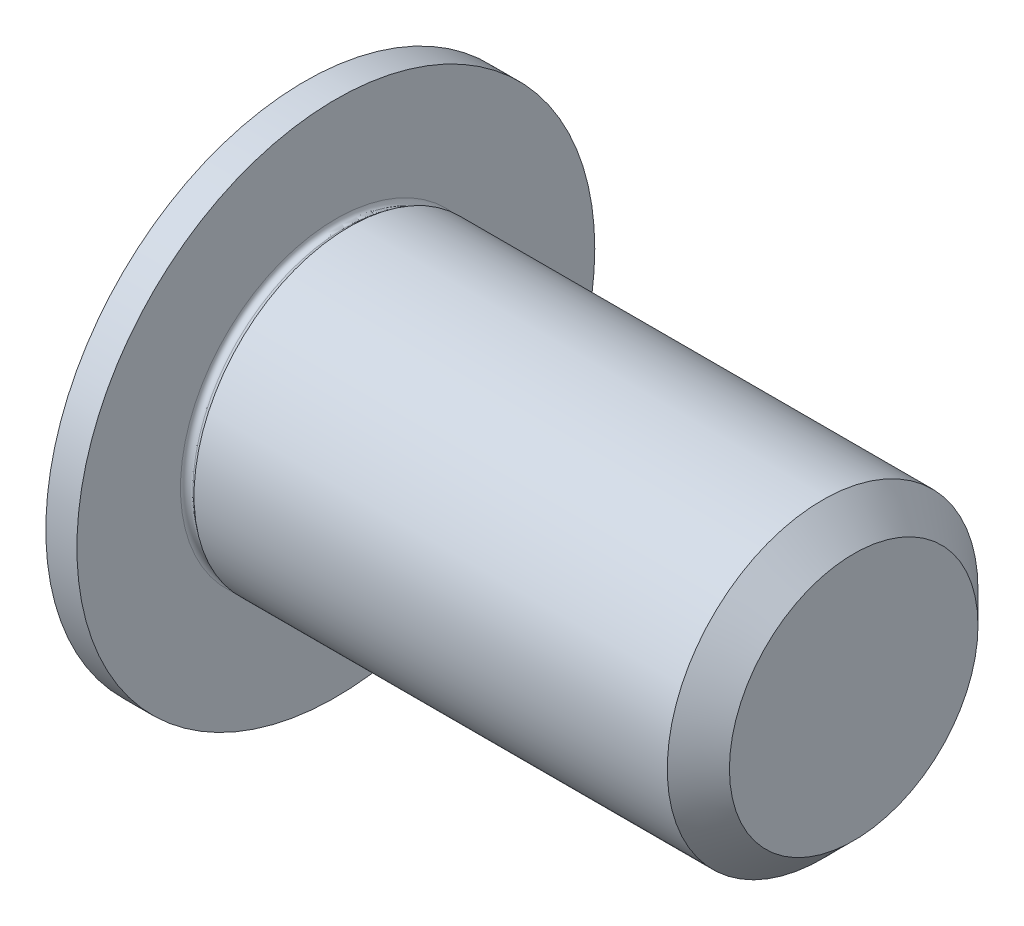
ISO-10303-21;
HEADER;
FILE_DESCRIPTION(('STEP AP214'),'2;1');
FILE_NAME('part.step','',(''),(''),'','','');
FILE_SCHEMA(('AUTOMOTIVE_DESIGN { 1 0 10303 214 1 1 1 1 }'));
ENDSEC;
DATA;
#1=APPLICATION_CONTEXT('core data for automotive mechanical design processes');
#2=APPLICATION_PROTOCOL_DEFINITION('international standard','automotive_design',2000,#1);
#3=PRODUCT_CONTEXT('',#1,'mechanical');
#4=PRODUCT('Part','Part','',(#3));
#5=PRODUCT_RELATED_PRODUCT_CATEGORY('part','',(#4));
#6=PRODUCT_DEFINITION_FORMATION('','',#4);
#7=PRODUCT_DEFINITION_CONTEXT('part definition',#1,'design');
#8=PRODUCT_DEFINITION('design','',#6,#7);
#9=PRODUCT_DEFINITION_SHAPE('','',#8);
#10=(LENGTH_UNIT() NAMED_UNIT(*) SI_UNIT(.MILLI.,.METRE.));
#11=(NAMED_UNIT(*) PLANE_ANGLE_UNIT() SI_UNIT($,.RADIAN.));
#12=(NAMED_UNIT(*) SI_UNIT($,.STERADIAN.) SOLID_ANGLE_UNIT());
#13=UNCERTAINTY_MEASURE_WITH_UNIT(LENGTH_MEASURE(1.E-05),#10,'distance_accuracy_value','');
#14=(GEOMETRIC_REPRESENTATION_CONTEXT(3) GLOBAL_UNCERTAINTY_ASSIGNED_CONTEXT((#13)) GLOBAL_UNIT_ASSIGNED_CONTEXT((#10,
#11,#12)) REPRESENTATION_CONTEXT('',''));
#15=CARTESIAN_POINT('',(0.,0.,0.));
#16=DIRECTION('',(0.,0.,1.));
#17=DIRECTION('',(1.,0.,0.));
#18=AXIS2_PLACEMENT_3D('',#15,#16,#17);
#19=CARTESIAN_POINT('',(0.,0.,0.));
#20=DIRECTION('',(0.999999999999998,0.,0.));
#21=DIRECTION('',(0.,0.,-1.00000000000002));
#22=AXIS2_PLACEMENT_3D('',#19,#20,#21);
#23=PLANE('',#22);
#24=CARTESIAN_POINT('',(0.,0.,0.));
#25=DIRECTION('',(0.999999999999998,0.,0.));
#26=DIRECTION('',(0.,0.,-1.00000000000002));
#27=AXIS2_PLACEMENT_3D('',#24,#25,#26);
#28=CIRCLE('',#27,2.4);
#29=CARTESIAN_POINT('',(0.,0.,-2.40000000000004));
#30=VERTEX_POINT('',#29);
#31=EDGE_CURVE('E64',#30,#30,#28,.T.);
#32=ORIENTED_EDGE('',*,*,#31,.T.);
#33=EDGE_LOOP('',(#32));
#34=FACE_BOUND('',#33,.T.);
#35=ADVANCED_FACE('F53',(#34),#23,.T.);
#36=CARTESIAN_POINT('',(0.,0.,0.));
#37=DIRECTION('',(0.999999999999998,0.,0.));
#38=DIRECTION('',(0.,0.,-1.00000000000002));
#39=AXIS2_PLACEMENT_3D('',#36,#37,#38);
#40=CYLINDRICAL_SURFACE('',#39,3.);
#41=CARTESIAN_POINT('',(-0.600000000000156,0.,-2.22044604925031E-13));
#42=DIRECTION('',(0.999999999999998,0.,0.));
#43=DIRECTION('',(0.,0.,-1.00000000000002));
#44=AXIS2_PLACEMENT_3D('',#41,#42,#43);
#45=CIRCLE('',#44,3.);
#46=CARTESIAN_POINT('',(-0.600000000000156,0.,-3.00000000000005));
#47=VERTEX_POINT('',#46);
#48=EDGE_CURVE('E12',#47,#47,#45,.F.);
#49=CARTESIAN_POINT('',(-9.73819660112496,0.,1.77635683940025E-12));
#50=DIRECTION('',(0.999999999999998,0.,0.));
#51=DIRECTION('',(0.,0.,-1.00000000000002));
#52=AXIS2_PLACEMENT_3D('',#49,#50,#51);
#53=CIRCLE('',#52,3.);
#54=CARTESIAN_POINT('',(-9.73819660112496,0.,-3.00000000000005));
#55=VERTEX_POINT('',#54);
#56=EDGE_CURVE('E188',#55,#55,#53,.T.);
#57=CARTESIAN_POINT('',(-0.600000000000156,0.,-3.00000000000005));
#58=CARTESIAN_POINT('',(-0.695189547928539,0.,-3.00000000000005));
#59=CARTESIAN_POINT('',(-0.790379095856923,0.,-3.00000000000005));
#60=CARTESIAN_POINT('',(-0.980758191713689,0.,-3.00000000000005));
#61=CARTESIAN_POINT('',(-1.07594773964207,0.,-3.00000000000005));
#62=CARTESIAN_POINT('',(-1.26632683549884,0.,-3.00000000000005));
#63=CARTESIAN_POINT('',(-1.36151638342722,0.,-3.00000000000005));
#64=CARTESIAN_POINT('',(-1.55189547928399,0.,-3.00000000000005));
#65=CARTESIAN_POINT('',(-1.64708502721237,0.,-3.00000000000005));
#66=CARTESIAN_POINT('',(-1.83746412306914,0.,-3.00000000000005));
#67=CARTESIAN_POINT('',(-1.93265367099752,0.,-3.00000000000005));
#68=CARTESIAN_POINT('',(-2.12303276685429,0.,-3.00000000000005));
#69=CARTESIAN_POINT('',(-2.21822231478267,0.,-3.00000000000005));
#70=CARTESIAN_POINT('',(-2.40860141063944,0.,-3.00000000000005));
#71=CARTESIAN_POINT('',(-2.50379095856782,0.,-3.00000000000005));
#72=CARTESIAN_POINT('',(-2.69417005442459,0.,-3.00000000000005));
#73=CARTESIAN_POINT('',(-2.78935960235297,0.,-3.00000000000005));
#74=CARTESIAN_POINT('',(-2.97973869820974,0.,-3.00000000000005));
#75=CARTESIAN_POINT('',(-3.07492824613812,0.,-3.00000000000005));
#76=CARTESIAN_POINT('',(-3.26530734199489,0.,-3.00000000000005));
#77=CARTESIAN_POINT('',(-3.36049688992327,0.,-3.00000000000005));
#78=CARTESIAN_POINT('',(-3.55087598578004,0.,-3.00000000000005));
#79=CARTESIAN_POINT('',(-3.64606553370842,0.,-3.00000000000005));
#80=CARTESIAN_POINT('',(-3.83644462956519,0.,-3.00000000000005));
#81=CARTESIAN_POINT('',(-3.93163417749357,0.,-3.00000000000005));
#82=CARTESIAN_POINT('',(-4.12201327335034,0.,-3.00000000000005));
#83=CARTESIAN_POINT('',(-4.21720282127872,0.,-3.00000000000005));
#84=CARTESIAN_POINT('',(-4.40758191713549,0.,-3.00000000000005));
#85=CARTESIAN_POINT('',(-4.50277146506387,0.,-3.00000000000005));
#86=CARTESIAN_POINT('',(-4.69315056092064,0.,-3.00000000000005));
#87=CARTESIAN_POINT('',(-4.78834010884902,0.,-3.00000000000005));
#88=CARTESIAN_POINT('',(-4.97871920470579,0.,-3.00000000000005));
#89=CARTESIAN_POINT('',(-5.07390875263417,0.,-3.00000000000005));
#90=CARTESIAN_POINT('',(-5.26428784849094,0.,-3.00000000000005));
#91=CARTESIAN_POINT('',(-5.35947739641932,0.,-3.00000000000005));
#92=CARTESIAN_POINT('',(-5.54985649227609,0.,-3.00000000000005));
#93=CARTESIAN_POINT('',(-5.64504604020447,0.,-3.00000000000005));
#94=CARTESIAN_POINT('',(-5.83542513606124,0.,-3.00000000000005));
#95=CARTESIAN_POINT('',(-5.93061468398963,0.,-3.00000000000005));
#96=CARTESIAN_POINT('',(-6.12099377984639,0.,-3.00000000000005));
#97=CARTESIAN_POINT('',(-6.21618332777478,0.,-3.00000000000005));
#98=CARTESIAN_POINT('',(-6.40656242363154,0.,-3.00000000000005));
#99=CARTESIAN_POINT('',(-6.50175197155992,0.,-3.00000000000005));
#100=CARTESIAN_POINT('',(-6.69213106741669,0.,-3.00000000000005));
#101=CARTESIAN_POINT('',(-6.78732061534507,0.,-3.00000000000005));
#102=CARTESIAN_POINT('',(-6.97769971120184,0.,-3.00000000000005));
#103=CARTESIAN_POINT('',(-7.07288925913023,0.,-3.00000000000005));
#104=CARTESIAN_POINT('',(-7.26326835498699,0.,-3.00000000000005));
#105=CARTESIAN_POINT('',(-7.35845790291538,0.,-3.00000000000005));
#106=CARTESIAN_POINT('',(-7.54883699877214,0.,-3.00000000000005));
#107=CARTESIAN_POINT('',(-7.64402654670053,0.,-3.00000000000005));
#108=CARTESIAN_POINT('',(-7.83440564255729,0.,-3.00000000000005));
#109=CARTESIAN_POINT('',(-7.92959519048568,0.,-3.00000000000005));
#110=CARTESIAN_POINT('',(-8.11997428634244,0.,-3.00000000000005));
#111=CARTESIAN_POINT('',(-8.21516383427083,0.,-3.00000000000005));
#112=CARTESIAN_POINT('',(-8.40554293012759,0.,-3.00000000000005));
#113=CARTESIAN_POINT('',(-8.50073247805598,0.,-3.00000000000005));
#114=CARTESIAN_POINT('',(-8.69111157391274,0.,-3.00000000000005));
#115=CARTESIAN_POINT('',(-8.78630112184113,0.,-3.00000000000005));
#116=CARTESIAN_POINT('',(-8.97668021769789,0.,-3.00000000000005));
#117=CARTESIAN_POINT('',(-9.07186976562628,0.,-3.00000000000005));
#118=CARTESIAN_POINT('',(-9.26224886148304,0.,-3.00000000000005));
#119=CARTESIAN_POINT('',(-9.35743840941143,0.,-3.00000000000005));
#120=CARTESIAN_POINT('',(-9.54781750526819,0.,-3.00000000000005));
#121=CARTESIAN_POINT('',(-9.64300705319658,0.,-3.00000000000005));
#122=CARTESIAN_POINT('',(-9.73819660112496,0.,-3.00000000000005));
#123=B_SPLINE_CURVE_WITH_KNOTS('',3,(#57,#58,#59,#60,#61,#62,#63,#64,#65,#66,#67,#68,#69,#70,
#71,#72,#73,#74,#75,#76,#77,#78,#79,#80,#81,#82,#83,#84,#85,#86,#87,#88,#89,#90,#91,#92,#93,#94,
#95,#96,#97,#98,#99,#100,#101,#102,#103,#104,#105,#106,#107,#108,#109,#110,#111,#112,#113,#114,
#115,#116,#117,#118,#119,#120,#121,#122),.UNSPECIFIED.,.F.,.F.,(4,2,2,2,2,2,2,2,2,2,2,2,2,2,2,2,
2,2,2,2,2,2,2,2,2,2,2,2,2,2,2,2,4),(0.,0.28556864378515,0.5711372875703,0.85670593135545,
1.1422745751406,1.42784321892575,1.7134118627109,1.99898050649605,2.2845491502812,
2.57011779406635,2.8556864378515,3.14125508163665,3.4268237254218,3.71239236920695,
3.9979610129921,4.28352965677725,4.5690983005624,4.85466694434755,5.1402355881327,
5.42580423191785,5.711372875703,5.99694151948815,6.2825101632733,6.56807880705845,
6.8536474508436,7.13921609462875,7.4247847384139,7.71035338219906,7.9959220259842,
8.28149066976935,8.5670593135545,8.85262795733965,9.1381966011248),.UNSPECIFIED.);
#124=EDGE_CURVE('BSEAM272',#47,#55,#123,.T.);
#125=ORIENTED_EDGE('',*,*,#48,.T.);
#126=ORIENTED_EDGE('',*,*,#56,.T.);
#127=ORIENTED_EDGE('',*,*,#124,.T.);
#128=ORIENTED_EDGE('',*,*,#124,.F.);
#129=EDGE_LOOP('',(#125,#127,#126,#128));
#130=FACE_BOUND('',#129,.T.);
#131=ADVANCED_FACE('F272',(#130),#40,.T.);
#132=CARTESIAN_POINT('',(-9.73819660112496,0.,1.77635683940025E-12));
#133=DIRECTION('',(0.999999999999998,0.,0.));
#134=DIRECTION('',(0.,0.,-1.00000000000002));
#135=AXIS2_PLACEMENT_3D('',#132,#133,#134);
#136=CONICAL_SURFACE('',#135,3.,0.666239432492519);
#137=CARTESIAN_POINT('',(-9.83819660112517,0.,1.77635683940025E-12));
#138=DIRECTION('',(0.999999999999998,0.,0.));
#139=DIRECTION('',(0.,0.,-1.00000000000002));
#140=AXIS2_PLACEMENT_3D('',#137,#138,#139);
#141=CIRCLE('',#140,2.92138486222425);
#142=CARTESIAN_POINT('',(-9.83819660112517,0.,-2.92138486222236));
#143=VERTEX_POINT('',#142);
#144=EDGE_CURVE('E184',#143,#143,#141,.T.);
#145=CARTESIAN_POINT('',(-9.83819660112517,0.,-2.92138486222236));
#146=CARTESIAN_POINT('',(-9.8371549344585,0.,-2.92220376990753));
#147=CARTESIAN_POINT('',(-9.83611326779183,0.,-2.92302267759269));
#148=CARTESIAN_POINT('',(-9.83402993445849,0.,-2.92466049296302));
#149=CARTESIAN_POINT('',(-9.83298826779182,0.,-2.92547940064819));
#150=CARTESIAN_POINT('',(-9.83090493445849,0.,-2.92711721601852));
#151=CARTESIAN_POINT('',(-9.82986326779182,0.,-2.92793612370369));
#152=CARTESIAN_POINT('',(-9.82777993445848,0.,-2.92957393907402));
#153=CARTESIAN_POINT('',(-9.82673826779181,0.,-2.93039284675918));
#154=CARTESIAN_POINT('',(-9.82465493445847,0.,-2.93203066212952));
#155=CARTESIAN_POINT('',(-9.8236132677918,0.,-2.93284956981468));
#156=CARTESIAN_POINT('',(-9.82152993445847,0.,-2.93448738518501));
#157=CARTESIAN_POINT('',(-9.8204882677918,0.,-2.93530629287018));
#158=CARTESIAN_POINT('',(-9.81840493445846,0.,-2.93694410824051));
#159=CARTESIAN_POINT('',(-9.81736326779179,0.,-2.93776301592568));
#160=CARTESIAN_POINT('',(-9.81527993445845,0.,-2.93940083129601));
#161=CARTESIAN_POINT('',(-9.81423826779178,0.,-2.94021973898117));
#162=CARTESIAN_POINT('',(-9.81215493445845,0.,-2.9418575543515));
#163=CARTESIAN_POINT('',(-9.81111326779178,0.,-2.94267646203667));
#164=CARTESIAN_POINT('',(-9.80902993445844,0.,-2.944314277407));
#165=CARTESIAN_POINT('',(-9.80798826779177,0.,-2.94513318509217));
#166=CARTESIAN_POINT('',(-9.80590493445843,0.,-2.9467710004625));
#167=CARTESIAN_POINT('',(-9.80486326779176,0.,-2.94758990814766));
#168=CARTESIAN_POINT('',(-9.80277993445843,0.,-2.949227723518));
#169=CARTESIAN_POINT('',(-9.80173826779176,0.,-2.95004663120316));
#170=CARTESIAN_POINT('',(-9.79965493445842,0.,-2.95168444657349));
#171=CARTESIAN_POINT('',(-9.79861326779175,0.,-2.95250335425866));
#172=CARTESIAN_POINT('',(-9.79652993445842,0.,-2.95414116962899));
#173=CARTESIAN_POINT('',(-9.79548826779174,0.,-2.95496007731416));
#174=CARTESIAN_POINT('',(-9.79340493445841,0.,-2.95659789268449));
#175=CARTESIAN_POINT('',(-9.79236326779174,0.,-2.95741680036965));
#176=CARTESIAN_POINT('',(-9.7902799344584,0.,-2.95905461573998));
#177=CARTESIAN_POINT('',(-9.78923826779173,0.,-2.95987352342515));
#178=CARTESIAN_POINT('',(-9.7871549344584,0.,-2.96151133879548));
#179=CARTESIAN_POINT('',(-9.78611326779173,0.,-2.96233024648065));
#180=CARTESIAN_POINT('',(-9.78402993445839,0.,-2.96396806185098));
#181=CARTESIAN_POINT('',(-9.78298826779172,0.,-2.96478696953614));
#182=CARTESIAN_POINT('',(-9.78090493445838,0.,-2.96642478490648));
#183=CARTESIAN_POINT('',(-9.77986326779171,0.,-2.96724369259164));
#184=CARTESIAN_POINT('',(-9.77777993445838,0.,-2.96888150796197));
#185=CARTESIAN_POINT('',(-9.77673826779171,0.,-2.96970041564714));
#186=CARTESIAN_POINT('',(-9.77465493445837,0.,-2.97133823101747));
#187=CARTESIAN_POINT('',(-9.7736132677917,0.,-2.97215713870264));
#188=CARTESIAN_POINT('',(-9.77152993445836,0.,-2.97379495407297));
#189=CARTESIAN_POINT('',(-9.77048826779169,0.,-2.97461386175813));
#190=CARTESIAN_POINT('',(-9.76840493445836,0.,-2.97625167712846));
#191=CARTESIAN_POINT('',(-9.76736326779169,0.,-2.97707058481363));
#192=CARTESIAN_POINT('',(-9.76527993445835,0.,-2.97870840018396));
#193=CARTESIAN_POINT('',(-9.76423826779168,0.,-2.97952730786913));
#194=CARTESIAN_POINT('',(-9.76215493445834,0.,-2.98116512323946));
#195=CARTESIAN_POINT('',(-9.76111326779167,0.,-2.98198403092462));
#196=CARTESIAN_POINT('',(-9.75902993445834,0.,-2.98362184629496));
#197=CARTESIAN_POINT('',(-9.75798826779167,0.,-2.98444075398012));
#198=CARTESIAN_POINT('',(-9.75590493445833,0.,-2.98607856935045));
#199=CARTESIAN_POINT('',(-9.75486326779166,0.,-2.98689747703562));
#200=CARTESIAN_POINT('',(-9.75277993445832,0.,-2.98853529240595));
#201=CARTESIAN_POINT('',(-9.75173826779166,0.,-2.98935420009112));
#202=CARTESIAN_POINT('',(-9.74965493445832,0.,-2.99099201546145));
#203=CARTESIAN_POINT('',(-9.74861326779165,0.,-2.99181092314661));
#204=CARTESIAN_POINT('',(-9.74652993445831,0.,-2.99344873851695));
#205=CARTESIAN_POINT('',(-9.74548826779164,0.,-2.99426764620211));
#206=CARTESIAN_POINT('',(-9.7434049344583,0.,-2.99590546157244));
#207=CARTESIAN_POINT('',(-9.74236326779164,0.,-2.99672436925761));
#208=CARTESIAN_POINT('',(-9.7402799344583,0.,-2.99836218462794));
#209=CARTESIAN_POINT('',(-9.73923826779163,0.,-2.9991810923131));
#210=CARTESIAN_POINT('',(-9.73819660112496,0.,-2.99999999999827));
#211=B_SPLINE_CURVE_WITH_KNOTS('',3,(#145,#146,#147,#148,#149,#150,#151,#152,#153,#154,#155,
#156,#157,#158,#159,#160,#161,#162,#163,#164,#165,#166,#167,#168,#169,#170,#171,#172,#173,#174,
#175,#176,#177,#178,#179,#180,#181,#182,#183,#184,#185,#186,#187,#188,#189,#190,#191,#192,#193,
#194,#195,#196,#197,#198,#199,#200,#201,#202,#203,#204,#205,#206,#207,#208,#209,#210),
.UNSPECIFIED.,.F.,.F.,(4,2,2,2,2,2,2,2,2,2,2,2,2,2,2,2,2,2,2,2,2,2,2,2,2,2,2,2,2,2,2,2,4),(0.,
0.00397506140473981,0.00795012280947962,0.0119251842142194,0.0159002456189595,
0.0198753070236993,0.0238503684284391,0.0278254298331789,0.0318004912379187,0.0357755526426591,
0.0397506140473989,0.0437256754521387,0.0477007368568785,0.0516757982616186,0.0556508596663584,
0.0596259210710982,0.063600982475838,0.0675760438805778,0.0715511052853179,0.0755261666900577,
0.0795012280947978,0.0834762894995376,0.0874513509042774,0.0914264123090175,0.0954014737137573,
0.0993765351184971,0.103351596523237,0.107326657927975,0.111301719332717,0.115276780737457,
0.119251842142195,0.123226903546937,0.127201964951675),.UNSPECIFIED.);
#212=EDGE_CURVE('BSEAM277',#143,#55,#211,.T.);
#213=ORIENTED_EDGE('',*,*,#144,.T.);
#214=ORIENTED_EDGE('',*,*,#56,.F.);
#215=ORIENTED_EDGE('',*,*,#212,.T.);
#216=ORIENTED_EDGE('',*,*,#212,.F.);
#217=EDGE_LOOP('',(#213,#215,#214,#216));
#218=FACE_BOUND('',#217,.T.);
#219=ADVANCED_FACE('F277',(#218),#136,.T.);
#220=CARTESIAN_POINT('',(-9.90000000000002,0.,1.77635683940025E-12));
#221=DIRECTION('',(0.999999999999998,0.,0.));
#222=DIRECTION('',(0.,0.,-1.00000000000002));
#223=AXIS2_PLACEMENT_3D('',#220,#221,#222);
#224=TOROIDAL_SURFACE('',#223,3.,0.100000000000001);
#225=CARTESIAN_POINT('',(-10.,0.,1.99840144432528E-12));
#226=DIRECTION('',(0.999999999999998,0.,0.));
#227=DIRECTION('',(0.,0.,-1.00000000000002));
#228=AXIS2_PLACEMENT_3D('',#225,#226,#227);
#229=CIRCLE('',#228,3.);
#230=CARTESIAN_POINT('',(-10.,0.,-2.99999999999805));
#231=VERTEX_POINT('',#230);
#232=EDGE_CURVE('E180',#231,#231,#229,.T.);
#233=ORIENTED_EDGE('',*,*,#232,.T.);
#234=EDGE_LOOP('',(#233));
#235=FACE_BOUND('',#234,.T.);
#236=ORIENTED_EDGE('',*,*,#144,.F.);
#237=EDGE_LOOP('',(#236));
#238=FACE_BOUND('',#237,.T.);
#239=ADVANCED_FACE('F283',(#235,#238),#224,.F.);
#240=CARTESIAN_POINT('',(-10.,2.99999999999989,2.66453525910038E-12));
#241=DIRECTION('',(0.999999999999998,0.,0.));
#242=DIRECTION('',(0.,0.,-1.00000000000002));
#243=AXIS2_PLACEMENT_3D('',#240,#241,#242);
#244=PLANE('',#243);
#245=CARTESIAN_POINT('',(-10.,0.,1.99840144432528E-12));
#246=DIRECTION('',(0.999999999999998,0.,0.));
#247=DIRECTION('',(0.,0.,-1.00000000000002));
#248=AXIS2_PLACEMENT_3D('',#245,#246,#247);
#249=CIRCLE('',#248,5.);
#250=CARTESIAN_POINT('',(-10.,0.,-5.00000000000008));
#251=VERTEX_POINT('',#250);
#252=EDGE_CURVE('E176',#251,#251,#249,.T.);
#253=ORIENTED_EDGE('',*,*,#252,.T.);
#254=EDGE_LOOP('',(#253));
#255=FACE_BOUND('',#254,.T.);
#256=ORIENTED_EDGE('',*,*,#232,.F.);
#257=EDGE_LOOP('',(#256));
#258=FACE_BOUND('',#257,.T.);
#259=ADVANCED_FACE('F287',(#255,#258),#244,.T.);
#260=CARTESIAN_POINT('',(0.,0.,0.));
#261=DIRECTION('',(0.999999999999998,0.,0.));
#262=DIRECTION('',(0.,0.,-1.00000000000002));
#263=AXIS2_PLACEMENT_3D('',#260,#261,#262);
#264=CYLINDRICAL_SURFACE('',#263,5.);
#265=CARTESIAN_POINT('',(-10.5999999999999,0.,3.77475828372553E-12));
#266=DIRECTION('',(0.999999999999998,0.,0.));
#267=DIRECTION('',(0.,0.,-1.00000000000002));
#268=AXIS2_PLACEMENT_3D('',#265,#266,#267);
#269=CIRCLE('',#268,5.);
#270=CARTESIAN_POINT('',(-10.5999999999999,0.,-5.00000000000008));
#271=VERTEX_POINT('',#270);
#272=EDGE_CURVE('E172',#271,#271,#269,.T.);
#273=CARTESIAN_POINT('',(-10.5999999999999,0.,-5.00000000000008));
#274=CARTESIAN_POINT('',(-10.5937499999999,0.,-5.00000000000008));
#275=CARTESIAN_POINT('',(-10.5874999999999,0.,-5.00000000000008));
#276=CARTESIAN_POINT('',(-10.5749999999999,0.,-5.00000000000008));
#277=CARTESIAN_POINT('',(-10.5687499999999,0.,-5.00000000000008));
#278=CARTESIAN_POINT('',(-10.5562499999999,0.,-5.00000000000008));
#279=CARTESIAN_POINT('',(-10.5499999999999,0.,-5.00000000000008));
#280=CARTESIAN_POINT('',(-10.5374999999999,0.,-5.00000000000008));
#281=CARTESIAN_POINT('',(-10.5312499999999,0.,-5.00000000000008));
#282=CARTESIAN_POINT('',(-10.5187499999999,0.,-5.00000000000008));
#283=CARTESIAN_POINT('',(-10.5125,0.,-5.00000000000008));
#284=CARTESIAN_POINT('',(-10.5,0.,-5.00000000000008));
#285=CARTESIAN_POINT('',(-10.49375,0.,-5.00000000000008));
#286=CARTESIAN_POINT('',(-10.48125,0.,-5.00000000000008));
#287=CARTESIAN_POINT('',(-10.475,0.,-5.00000000000008));
#288=CARTESIAN_POINT('',(-10.4625,0.,-5.00000000000008));
#289=CARTESIAN_POINT('',(-10.45625,0.,-5.00000000000008));
#290=CARTESIAN_POINT('',(-10.44375,0.,-5.00000000000008));
#291=CARTESIAN_POINT('',(-10.4375,0.,-5.00000000000008));
#292=CARTESIAN_POINT('',(-10.425,0.,-5.00000000000008));
#293=CARTESIAN_POINT('',(-10.41875,0.,-5.00000000000008));
#294=CARTESIAN_POINT('',(-10.40625,0.,-5.00000000000008));
#295=CARTESIAN_POINT('',(-10.4,0.,-5.00000000000008));
#296=CARTESIAN_POINT('',(-10.3875,0.,-5.00000000000008));
#297=CARTESIAN_POINT('',(-10.38125,0.,-5.00000000000008));
#298=CARTESIAN_POINT('',(-10.36875,0.,-5.00000000000008));
#299=CARTESIAN_POINT('',(-10.3625,0.,-5.00000000000008));
#300=CARTESIAN_POINT('',(-10.35,0.,-5.00000000000008));
#301=CARTESIAN_POINT('',(-10.34375,0.,-5.00000000000008));
#302=CARTESIAN_POINT('',(-10.33125,0.,-5.00000000000008));
#303=CARTESIAN_POINT('',(-10.325,0.,-5.00000000000008));
#304=CARTESIAN_POINT('',(-10.3125,0.,-5.00000000000008));
#305=CARTESIAN_POINT('',(-10.30625,0.,-5.00000000000008));
#306=CARTESIAN_POINT('',(-10.29375,0.,-5.00000000000008));
#307=CARTESIAN_POINT('',(-10.2875,0.,-5.00000000000008));
#308=CARTESIAN_POINT('',(-10.275,0.,-5.00000000000008));
#309=CARTESIAN_POINT('',(-10.26875,0.,-5.00000000000008));
#310=CARTESIAN_POINT('',(-10.25625,0.,-5.00000000000008));
#311=CARTESIAN_POINT('',(-10.25,0.,-5.00000000000008));
#312=CARTESIAN_POINT('',(-10.2375,0.,-5.00000000000008));
#313=CARTESIAN_POINT('',(-10.23125,0.,-5.00000000000008));
#314=CARTESIAN_POINT('',(-10.21875,0.,-5.00000000000008));
#315=CARTESIAN_POINT('',(-10.2125,0.,-5.00000000000008));
#316=CARTESIAN_POINT('',(-10.2,0.,-5.00000000000008));
#317=CARTESIAN_POINT('',(-10.19375,0.,-5.00000000000008));
#318=CARTESIAN_POINT('',(-10.18125,0.,-5.00000000000008));
#319=CARTESIAN_POINT('',(-10.175,0.,-5.00000000000008));
#320=CARTESIAN_POINT('',(-10.1625,0.,-5.00000000000008));
#321=CARTESIAN_POINT('',(-10.15625,0.,-5.00000000000008));
#322=CARTESIAN_POINT('',(-10.14375,0.,-5.00000000000008));
#323=CARTESIAN_POINT('',(-10.1375,0.,-5.00000000000008));
#324=CARTESIAN_POINT('',(-10.125,0.,-5.00000000000008));
#325=CARTESIAN_POINT('',(-10.11875,0.,-5.00000000000008));
#326=CARTESIAN_POINT('',(-10.10625,0.,-5.00000000000008));
#327=CARTESIAN_POINT('',(-10.1,0.,-5.00000000000008));
#328=CARTESIAN_POINT('',(-10.0875,0.,-5.00000000000008));
#329=CARTESIAN_POINT('',(-10.08125,0.,-5.00000000000008));
#330=CARTESIAN_POINT('',(-10.06875,0.,-5.00000000000008));
#331=CARTESIAN_POINT('',(-10.0625,0.,-5.00000000000008));
#332=CARTESIAN_POINT('',(-10.05,0.,-5.00000000000008));
#333=CARTESIAN_POINT('',(-10.04375,0.,-5.00000000000008));
#334=CARTESIAN_POINT('',(-10.03125,0.,-5.00000000000008));
#335=CARTESIAN_POINT('',(-10.025,0.,-5.00000000000008));
#336=CARTESIAN_POINT('',(-10.0125,0.,-5.00000000000008));
#337=CARTESIAN_POINT('',(-10.00625,0.,-5.00000000000008));
#338=CARTESIAN_POINT('',(-10.,0.,-5.00000000000008));
#339=B_SPLINE_CURVE_WITH_KNOTS('',3,(#273,#274,#275,#276,#277,#278,#279,#280,#281,#282,#283,
#284,#285,#286,#287,#288,#289,#290,#291,#292,#293,#294,#295,#296,#297,#298,#299,#300,#301,#302,
#303,#304,#305,#306,#307,#308,#309,#310,#311,#312,#313,#314,#315,#316,#317,#318,#319,#320,#321,
#322,#323,#324,#325,#326,#327,#328,#329,#330,#331,#332,#333,#334,#335,#336,#337,#338),
.UNSPECIFIED.,.F.,.F.,(4,2,2,2,2,2,2,2,2,2,2,2,2,2,2,2,2,2,2,2,2,2,2,2,2,2,2,2,2,2,2,2,4),(0.,
0.0187499999999979,0.0374999999999959,0.0562499999999938,0.0749999999999917,0.0937499999999897,
0.112499999999988,0.131249999999986,0.149999999999983,0.168749999999981,0.187499999999979,
0.206249999999977,0.224999999999975,0.243749999999973,0.262499999999971,0.281249999999969,
0.299999999999967,0.318749999999965,0.337499999999963,0.356249999999961,0.374999999999959,
0.393749999999957,0.412499999999955,0.431249999999953,0.44999999999995,0.468749999999948,
0.487499999999946,0.506249999999944,0.524999999999942,0.54374999999994,0.562499999999938,
0.581249999999936,0.599999999999934),.UNSPECIFIED.);
#340=EDGE_CURVE('BSEAM291',#271,#251,#339,.T.);
#341=ORIENTED_EDGE('',*,*,#272,.T.);
#342=ORIENTED_EDGE('',*,*,#252,.F.);
#343=ORIENTED_EDGE('',*,*,#340,.T.);
#344=ORIENTED_EDGE('',*,*,#340,.F.);
#345=EDGE_LOOP('',(#341,#343,#342,#344));
#346=FACE_BOUND('',#345,.T.);
#347=ADVANCED_FACE('F291',(#346),#264,.T.);
#348=CARTESIAN_POINT('',(-10.5999999999999,0.,3.77475828372553E-12));
#349=DIRECTION('',(0.999999999999998,0.,0.));
#350=DIRECTION('',(0.,0.,-1.00000000000002));
#351=AXIS2_PLACEMENT_3D('',#348,#349,#350);
#352=CONICAL_SURFACE('',#351,5.,1.22173047639603);
#353=CARTESIAN_POINT('',(-11.1999999999999,0.,5.32907051820075E-12));
#354=DIRECTION('',(0.999999999999998,0.,0.));
#355=DIRECTION('',(0.,0.,-1.00000000000002));
#356=AXIS2_PLACEMENT_3D('',#353,#354,#355);
#357=CIRCLE('',#356,3.35151354832723);
#358=CARTESIAN_POINT('',(-11.1999999999999,0.,-3.3515135483237));
#359=VERTEX_POINT('',#358);
#360=EDGE_CURVE('E132',#359,#359,#357,.T.);
#361=CARTESIAN_POINT('',(-11.1999999999999,0.,-3.3515135483237));
#362=CARTESIAN_POINT('',(-11.1937499999999,0.,-3.36868528219529));
#363=CARTESIAN_POINT('',(-11.1874999999999,0.,-3.38585701606687));
#364=CARTESIAN_POINT('',(-11.1749999999999,0.,-3.42020048381005));
#365=CARTESIAN_POINT('',(-11.1687499999999,0.,-3.43737221768164));
#366=CARTESIAN_POINT('',(-11.1562499999999,0.,-3.47171568542482));
#367=CARTESIAN_POINT('',(-11.1499999999999,0.,-3.48888741929641));
#368=CARTESIAN_POINT('',(-11.1374999999999,0.,-3.52323088703959));
#369=CARTESIAN_POINT('',(-11.1312499999999,0.,-3.54040262091118));
#370=CARTESIAN_POINT('',(-11.1187499999999,0.,-3.57474608865436));
#371=CARTESIAN_POINT('',(-11.1124999999999,0.,-3.59191782252595));
#372=CARTESIAN_POINT('',(-11.0999999999999,0.,-3.62626129026913));
#373=CARTESIAN_POINT('',(-11.0937499999999,0.,-3.64343302414072));
#374=CARTESIAN_POINT('',(-11.0812499999999,0.,-3.6777764918839));
#375=CARTESIAN_POINT('',(-11.0749999999999,0.,-3.69494822575549));
#376=CARTESIAN_POINT('',(-11.0624999999999,0.,-3.72929169349867));
#377=CARTESIAN_POINT('',(-11.0562499999999,0.,-3.74646342737026));
#378=CARTESIAN_POINT('',(-11.0437499999999,0.,-3.78080689511344));
#379=CARTESIAN_POINT('',(-11.0374999999999,0.,-3.79797862898503));
#380=CARTESIAN_POINT('',(-11.0249999999999,0.,-3.83232209672821));
#381=CARTESIAN_POINT('',(-11.0187499999999,0.,-3.8494938305998));
#382=CARTESIAN_POINT('',(-11.0062499999999,0.,-3.88383729834298));
#383=CARTESIAN_POINT('',(-10.9999999999999,0.,-3.90100903221457));
#384=CARTESIAN_POINT('',(-10.9874999999999,0.,-3.93535249995774));
#385=CARTESIAN_POINT('',(-10.9812499999999,0.,-3.95252423382933));
#386=CARTESIAN_POINT('',(-10.9687499999999,0.,-3.98686770157251));
#387=CARTESIAN_POINT('',(-10.9624999999999,0.,-4.0040394354441));
#388=CARTESIAN_POINT('',(-10.9499999999999,0.,-4.03838290318728));
#389=CARTESIAN_POINT('',(-10.9437499999999,0.,-4.05555463705887));
#390=CARTESIAN_POINT('',(-10.9312499999999,0.,-4.08989810480205));
#391=CARTESIAN_POINT('',(-10.9249999999999,0.,-4.10706983867364));
#392=CARTESIAN_POINT('',(-10.9124999999999,0.,-4.14141330641682));
#393=CARTESIAN_POINT('',(-10.9062499999999,0.,-4.15858504028841));
#394=CARTESIAN_POINT('',(-10.8937499999999,0.,-4.19292850803159));
#395=CARTESIAN_POINT('',(-10.8874999999999,0.,-4.21010024190318));
#396=CARTESIAN_POINT('',(-10.8749999999999,0.,-4.24444370964636));
#397=CARTESIAN_POINT('',(-10.8687499999999,0.,-4.26161544351795));
#398=CARTESIAN_POINT('',(-10.8562499999999,0.,-4.29595891126113));
#399=CARTESIAN_POINT('',(-10.8499999999999,0.,-4.31313064513272));
#400=CARTESIAN_POINT('',(-10.8374999999999,0.,-4.3474741128759));
#401=CARTESIAN_POINT('',(-10.8312499999999,0.,-4.36464584674749));
#402=CARTESIAN_POINT('',(-10.8187499999999,0.,-4.39898931449067));
#403=CARTESIAN_POINT('',(-10.8124999999999,0.,-4.41616104836226));
#404=CARTESIAN_POINT('',(-10.7999999999999,0.,-4.45050451610544));
#405=CARTESIAN_POINT('',(-10.7937499999999,0.,-4.46767624997703));
#406=CARTESIAN_POINT('',(-10.7812499999999,0.,-4.50201971772021));
#407=CARTESIAN_POINT('',(-10.7749999999999,0.,-4.5191914515918));
#408=CARTESIAN_POINT('',(-10.7624999999999,0.,-4.55353491933498));
#409=CARTESIAN_POINT('',(-10.7562499999999,0.,-4.57070665320656));
#410=CARTESIAN_POINT('',(-10.7437499999999,0.,-4.60505012094974));
#411=CARTESIAN_POINT('',(-10.7374999999999,0.,-4.62222185482133));
#412=CARTESIAN_POINT('',(-10.7249999999999,0.,-4.65656532256451));
#413=CARTESIAN_POINT('',(-10.7187499999999,0.,-4.6737370564361));
#414=CARTESIAN_POINT('',(-10.7062499999999,0.,-4.70808052417928));
#415=CARTESIAN_POINT('',(-10.6999999999999,0.,-4.72525225805087));
#416=CARTESIAN_POINT('',(-10.6874999999999,0.,-4.75959572579405));
#417=CARTESIAN_POINT('',(-10.6812499999999,0.,-4.77676745966564));
#418=CARTESIAN_POINT('',(-10.6687499999999,0.,-4.81111092740882));
#419=CARTESIAN_POINT('',(-10.6624999999999,0.,-4.82828266128041));
#420=CARTESIAN_POINT('',(-10.6499999999999,0.,-4.86262612902359));
#421=CARTESIAN_POINT('',(-10.6437499999999,0.,-4.87979786289518));
#422=CARTESIAN_POINT('',(-10.6312499999999,0.,-4.91414133063836));
#423=CARTESIAN_POINT('',(-10.6249999999999,0.,-4.93131306450995));
#424=CARTESIAN_POINT('',(-10.6124999999999,0.,-4.96565653225313));
#425=CARTESIAN_POINT('',(-10.6062499999999,0.,-4.98282826612472));
#426=CARTESIAN_POINT('',(-10.5999999999999,0.,-4.99999999999631));
#427=B_SPLINE_CURVE_WITH_KNOTS('',3,(#361,#362,#363,#364,#365,#366,#367,#368,#369,#370,#371,
#372,#373,#374,#375,#376,#377,#378,#379,#380,#381,#382,#383,#384,#385,#386,#387,#388,#389,#390,
#391,#392,#393,#394,#395,#396,#397,#398,#399,#400,#401,#402,#403,#404,#405,#406,#407,#408,#409,
#410,#411,#412,#413,#414,#415,#416,#417,#418,#419,#420,#421,#422,#423,#424,#425,#426),
.UNSPECIFIED.,.F.,.F.,(4,2,2,2,2,2,2,2,2,2,2,2,2,2,2,2,2,2,2,2,2,2,2,2,2,2,2,2,2,2,2,2,4),(0.,
0.0548213325030517,0.109642665006104,0.164463997509157,0.21928533001221,0.274106662515262,
0.328927995018314,0.383749327521367,0.43857066002442,0.493391992527471,0.548213325030524,
0.603034657533577,0.657855990036629,0.712677322539681,0.767498655042734,0.822319987545787,
0.877141320048838,0.931962652551891,0.986783985054944,1.041605317558,1.09642665006105,
1.1512479825641,1.20606931506715,1.26089064757021,1.31571198007326,1.37053331257631,
1.42535464507936,1.48017597758242,1.53499731008547,1.58981864258852,1.64463997509157,
1.69946130759463,1.75428264009768),.UNSPECIFIED.);
#428=EDGE_CURVE('BSEAM295',#359,#271,#427,.T.);
#429=ORIENTED_EDGE('',*,*,#360,.T.);
#430=ORIENTED_EDGE('',*,*,#272,.F.);
#431=ORIENTED_EDGE('',*,*,#428,.T.);
#432=ORIENTED_EDGE('',*,*,#428,.F.);
#433=EDGE_LOOP('',(#429,#431,#430,#432));
#434=FACE_BOUND('',#433,.T.);
#435=ADVANCED_FACE('F295',(#434),#352,.T.);
#436=CARTESIAN_POINT('',(-11.1999999999999,3.35151354832752,4.88498130835069E-12));
#437=DIRECTION('',(-0.999999999999998,0.,0.));
#438=DIRECTION('',(0.,0.,1.00000000000002));
#439=AXIS2_PLACEMENT_3D('',#436,#437,#438);
#440=PLANE('',#439);
#441=DIRECTION('',(0.,0.500000000000002,-0.866025403784456));
#442=VECTOR('',#441,1.);
#443=CARTESIAN_POINT('',(-11.2,0.866025403784665,1.50000000000494));
#444=LINE('',#443,#442);
#445=CARTESIAN_POINT('',(-11.2,0.866025403784665,1.50000000000494));
#446=VERTEX_POINT('',#445);
#447=CARTESIAN_POINT('',(-11.1999999999999,1.73205080756866,3.5527136788005E-12));
#448=VERTEX_POINT('',#447);
#449=EDGE_CURVE('E73',#446,#448,#444,.T.);
#450=ORIENTED_EDGE('',*,*,#449,.F.);
#451=DIRECTION('',(0.,1.,0.));
#452=VECTOR('',#451,1.);
#453=CARTESIAN_POINT('',(-11.2,-0.866025403784665,1.50000000000494));
#454=LINE('',#453,#452);
#455=CARTESIAN_POINT('',(-11.2,-0.866025403784665,1.50000000000494));
#456=VERTEX_POINT('',#455);
#457=EDGE_CURVE('E135',#456,#446,#454,.T.);
#458=ORIENTED_EDGE('',*,*,#457,.F.);
#459=DIRECTION('',(0.,0.500000000000001,0.866025403784456));
#460=VECTOR('',#459,1.);
#461=CARTESIAN_POINT('',(-11.1999999999999,-1.73205080756889,5.32907051820075E-12));
#462=LINE('',#461,#460);
#463=CARTESIAN_POINT('',(-11.1999999999999,-1.73205080756889,5.32907051820075E-12));
#464=VERTEX_POINT('',#463);
#465=EDGE_CURVE('E140',#464,#456,#462,.T.);
#466=ORIENTED_EDGE('',*,*,#465,.F.);
#467=DIRECTION('',(0.,-0.500000000000002,0.866025403784456));
#468=VECTOR('',#467,1.);
#469=CARTESIAN_POINT('',(-11.1999999999999,-0.866025403784887,-1.49999999999606));
#470=LINE('',#469,#468);
#471=CARTESIAN_POINT('',(-11.1999999999999,-0.866025403784887,-1.49999999999606));
#472=VERTEX_POINT('',#471);
#473=EDGE_CURVE('E163',#472,#464,#470,.T.);
#474=ORIENTED_EDGE('',*,*,#473,.F.);
#475=DIRECTION('',(0.,-1.,0.));
#476=VECTOR('',#475,1.);
#477=CARTESIAN_POINT('',(-11.1999999999999,0.866025403784665,-1.49999999999517));
#478=LINE('',#477,#476);
#479=CARTESIAN_POINT('',(-11.1999999999999,0.866025403784665,-1.49999999999517));
#480=VERTEX_POINT('',#479);
#481=EDGE_CURVE('E154',#480,#472,#478,.T.);
#482=ORIENTED_EDGE('',*,*,#481,.F.);
#483=DIRECTION('',(0.,-0.500000000000002,-0.866025403784456));
#484=VECTOR('',#483,1.);
#485=CARTESIAN_POINT('',(-11.1999999999999,1.73205080756866,3.5527136788005E-12));
#486=LINE('',#485,#484);
#487=EDGE_CURVE('E147',#448,#480,#486,.T.);
#488=ORIENTED_EDGE('',*,*,#487,.F.);
#489=EDGE_LOOP('',(#450,#458,#466,#474,#482,#488));
#490=FACE_BOUND('',#489,.T.);
#491=ORIENTED_EDGE('',*,*,#360,.F.);
#492=EDGE_LOOP('',(#491));
#493=FACE_BOUND('',#492,.T.);
#494=ADVANCED_FACE('F143',(#490,#493),#440,.T.);
#495=CARTESIAN_POINT('',(-7.19999999999998,0.866025403784665,1.50000000000183));
#496=DIRECTION('',(0.,0.866025403784442,0.500000000000008));
#497=DIRECTION('',(0.,-0.500000000000002,0.866025403784456));
#498=AXIS2_PLACEMENT_3D('',#495,#496,#497);
#499=PLANE('',#498);
#500=ORIENTED_EDGE('',*,*,#449,.T.);
#501=DIRECTION('',(-0.999999999999998,0.,0.));
#502=VECTOR('',#501,1.);
#503=CARTESIAN_POINT('',(-7.19999999999987,1.73205080756866,8.88178419700125E-13));
#504=LINE('',#503,#502);
#505=CARTESIAN_POINT('',(-7.19999999999987,1.73205080756866,8.88178419700125E-13));
#506=VERTEX_POINT('',#505);
#507=EDGE_CURVE('E198',#506,#448,#504,.T.);
#508=ORIENTED_EDGE('',*,*,#507,.F.);
#509=DIRECTION('',(0.,-0.500000000000002,0.866025403784456));
#510=VECTOR('',#509,1.);
#511=CARTESIAN_POINT('',(-7.19999999999987,1.73205080756866,8.88178419700125E-13));
#512=LINE('',#511,#510);
#513=CARTESIAN_POINT('',(-7.19999999999998,0.866025403784665,1.50000000000183));
#514=VERTEX_POINT('',#513);
#515=EDGE_CURVE('E57',#514,#506,#512,.F.);
#516=ORIENTED_EDGE('',*,*,#515,.F.);
#517=DIRECTION('',(-0.999999999999998,0.,0.));
#518=VECTOR('',#517,1.);
#519=CARTESIAN_POINT('',(-7.19999999999998,0.866025403784665,1.50000000000183));
#520=LINE('',#519,#518);
#521=EDGE_CURVE('E129',#514,#446,#520,.T.);
#522=ORIENTED_EDGE('',*,*,#521,.T.);
#523=EDGE_LOOP('',(#500,#508,#516,#522));
#524=FACE_BOUND('',#523,.T.);
#525=ADVANCED_FACE('F130',(#524),#499,.F.);
#526=CARTESIAN_POINT('',(-7.19999999999998,-0.866025403784665,1.50000000000228));
#527=DIRECTION('',(0.,0.,1.00000000000002));
#528=DIRECTION('',(0.999999999999998,0.,0.));
#529=AXIS2_PLACEMENT_3D('',#526,#527,#528);
#530=PLANE('',#529);
#531=ORIENTED_EDGE('',*,*,#457,.T.);
#532=ORIENTED_EDGE('',*,*,#521,.F.);
#533=DIRECTION('',(0.,1.,0.));
#534=VECTOR('',#533,1.);
#535=CARTESIAN_POINT('',(-7.19999999999998,0.,1.50000000000228));
#536=LINE('',#535,#534);
#537=CARTESIAN_POINT('',(-7.19999999999998,-0.866025403784665,1.50000000000228));
#538=VERTEX_POINT('',#537);
#539=EDGE_CURVE('E97',#538,#514,#536,.T.);
#540=ORIENTED_EDGE('',*,*,#539,.F.);
#541=DIRECTION('',(-0.999999999999998,0.,0.));
#542=VECTOR('',#541,1.);
#543=CARTESIAN_POINT('',(-7.19999999999998,-0.866025403784665,1.50000000000228));
#544=LINE('',#543,#542);
#545=EDGE_CURVE('E125',#538,#456,#544,.T.);
#546=ORIENTED_EDGE('',*,*,#545,.T.);
#547=EDGE_LOOP('',(#531,#532,#540,#546));
#548=FACE_BOUND('',#547,.T.);
#549=ADVANCED_FACE('F136',(#548),#530,.F.);
#550=CARTESIAN_POINT('',(-7.19999999999987,-1.73205080756889,8.88178419700125E-13));
#551=DIRECTION('',(0.,-0.866025403784443,0.500000000000008));
#552=DIRECTION('',(0.,-0.500000000000001,-0.866025403784456));
#553=AXIS2_PLACEMENT_3D('',#550,#551,#552);
#554=PLANE('',#553);
#555=ORIENTED_EDGE('',*,*,#465,.T.);
#556=ORIENTED_EDGE('',*,*,#545,.F.);
#557=DIRECTION('',(0.,-0.500000000000001,-0.866025403784456));
#558=VECTOR('',#557,1.);
#559=CARTESIAN_POINT('',(-7.19999999999998,-0.866025403784665,1.50000000000228));
#560=LINE('',#559,#558);
#561=CARTESIAN_POINT('',(-7.19999999999987,-1.73205080756889,8.88178419700125E-13));
#562=VERTEX_POINT('',#561);
#563=EDGE_CURVE('E211',#562,#538,#560,.F.);
#564=ORIENTED_EDGE('',*,*,#563,.F.);
#565=DIRECTION('',(-0.999999999999998,0.,0.));
#566=VECTOR('',#565,1.);
#567=CARTESIAN_POINT('',(-7.19999999999987,-1.73205080756889,8.88178419700125E-13));
#568=LINE('',#567,#566);
#569=EDGE_CURVE('E196',#562,#464,#568,.T.);
#570=ORIENTED_EDGE('',*,*,#569,.T.);
#571=EDGE_LOOP('',(#555,#556,#564,#570));
#572=FACE_BOUND('',#571,.T.);
#573=ADVANCED_FACE('F262',(#572),#554,.F.);
#574=CARTESIAN_POINT('',(-7.19999999999987,-0.866025403784887,-1.49999999999828));
#575=DIRECTION('',(0.,-0.866025403784442,-0.500000000000008));
#576=DIRECTION('',(0.,0.500000000000002,-0.866025403784456));
#577=AXIS2_PLACEMENT_3D('',#574,#575,#576);
#578=PLANE('',#577);
#579=ORIENTED_EDGE('',*,*,#473,.T.);
#580=ORIENTED_EDGE('',*,*,#569,.F.);
#581=DIRECTION('',(0.,0.500000000000002,-0.866025403784456));
#582=VECTOR('',#581,1.);
#583=CARTESIAN_POINT('',(-7.19999999999987,-1.73205080756889,8.88178419700125E-13));
#584=LINE('',#583,#582);
#585=CARTESIAN_POINT('',(-7.19999999999987,-0.866025403784887,-1.49999999999828));
#586=VERTEX_POINT('',#585);
#587=EDGE_CURVE('E214',#586,#562,#584,.F.);
#588=ORIENTED_EDGE('',*,*,#587,.F.);
#589=DIRECTION('',(-0.999999999999998,0.,0.));
#590=VECTOR('',#589,1.);
#591=CARTESIAN_POINT('',(-7.19999999999987,-0.866025403784887,-1.49999999999828));
#592=LINE('',#591,#590);
#593=EDGE_CURVE('E204',#586,#472,#592,.T.);
#594=ORIENTED_EDGE('',*,*,#593,.T.);
#595=EDGE_LOOP('',(#579,#580,#588,#594));
#596=FACE_BOUND('',#595,.T.);
#597=ADVANCED_FACE('F259',(#596),#578,.F.);
#598=CARTESIAN_POINT('',(-7.19999999999987,0.866025403784665,-1.49999999999828));
#599=DIRECTION('',(0.,0.,-1.00000000000002));
#600=DIRECTION('',(0.,1.,0.));
#601=AXIS2_PLACEMENT_3D('',#598,#599,#600);
#602=PLANE('',#601);
#603=ORIENTED_EDGE('',*,*,#481,.T.);
#604=ORIENTED_EDGE('',*,*,#593,.F.);
#605=DIRECTION('',(0.,1.,0.));
#606=VECTOR('',#605,1.);
#607=CARTESIAN_POINT('',(-7.19999999999987,-2.22044604925031E-13,-1.49999999999784));
#608=LINE('',#607,#606);
#609=CARTESIAN_POINT('',(-7.19999999999987,0.866025403784665,-1.49999999999828));
#610=VERTEX_POINT('',#609);
#611=EDGE_CURVE('E217',#610,#586,#608,.F.);
#612=ORIENTED_EDGE('',*,*,#611,.F.);
#613=DIRECTION('',(-0.999999999999998,0.,0.));
#614=VECTOR('',#613,1.);
#615=CARTESIAN_POINT('',(-7.19999999999987,0.866025403784665,-1.49999999999828));
#616=LINE('',#615,#614);
#617=EDGE_CURVE('E201',#610,#480,#616,.T.);
#618=ORIENTED_EDGE('',*,*,#617,.T.);
#619=EDGE_LOOP('',(#603,#604,#612,#618));
#620=FACE_BOUND('',#619,.T.);
#621=ADVANCED_FACE('F234',(#620),#602,.F.);
#622=CARTESIAN_POINT('',(-7.19999999999987,1.73205080756866,8.88178419700125E-13));
#623=DIRECTION('',(0.,0.866025403784443,-0.500000000000008));
#624=DIRECTION('',(0.,0.500000000000002,0.866025403784456));
#625=AXIS2_PLACEMENT_3D('',#622,#623,#624);
#626=PLANE('',#625);
#627=ORIENTED_EDGE('',*,*,#487,.T.);
#628=ORIENTED_EDGE('',*,*,#617,.F.);
#629=DIRECTION('',(0.,0.500000000000002,0.866025403784456));
#630=VECTOR('',#629,1.);
#631=CARTESIAN_POINT('',(-7.19999999999987,0.866025403784665,-1.49999999999828));
#632=LINE('',#631,#630);
#633=EDGE_CURVE('E220',#506,#610,#632,.F.);
#634=ORIENTED_EDGE('',*,*,#633,.F.);
#635=ORIENTED_EDGE('',*,*,#507,.T.);
#636=EDGE_LOOP('',(#627,#628,#634,#635));
#637=FACE_BOUND('',#636,.T.);
#638=ADVANCED_FACE('F230',(#637),#626,.F.);
#639=CARTESIAN_POINT('',(0.,0.,0.));
#640=DIRECTION('',(-0.999999999999998,0.,0.));
#641=DIRECTION('',(0.,0.,1.00000000000002));
#642=AXIS2_PLACEMENT_3D('',#639,#640,#641);
#643=CONICAL_SURFACE('',#642,2.4,0.785398163397446);
#644=ORIENTED_EDGE('',*,*,#48,.F.);
#645=EDGE_LOOP('',(#644));
#646=FACE_BOUND('',#645,.T.);
#647=ORIENTED_EDGE('',*,*,#31,.F.);
#648=EDGE_LOOP('',(#647));
#649=FACE_BOUND('',#648,.T.);
#650=ADVANCED_FACE('F55',(#646,#649),#643,.T.);
#651=CARTESIAN_POINT('',(-6.63461538461552,-1.14914909348363,-0.663461538459309));
#652=DIRECTION('',(-0.98058067569092,-0.16984155512169,-0.098058067569094));
#653=DIRECTION('',(0.170664037196572,-0.985329278164297,0.));
#654=AXIS2_PLACEMENT_3D('',#651,#652,#653);
#655=PLANE('',#654);
#656=DIRECTION('',(-0.170664037196572,0.985329278164297,0.));
#657=VECTOR('',#656,1.);
#658=CARTESIAN_POINT('',(-6.90000000000013,0.,8.88178419700125E-13));
#659=LINE('',#658,#657);
#660=CARTESIAN_POINT('',(-6.90000000000013,0.,8.88178419700125E-13));
#661=VERTEX_POINT('',#660);
#662=EDGE_CURVE('E107',#661,#506,#659,.T.);
#663=ORIENTED_EDGE('',*,*,#662,.F.);
#664=DIRECTION('',(-0.170664037196572,0.492664639082149,0.853320185982878));
#665=VECTOR('',#664,1.);
#666=CARTESIAN_POINT('',(-6.90000000000013,0.,8.88178419700125E-13));
#667=LINE('',#666,#665);
#668=EDGE_CURVE('E149',#661,#514,#667,.T.);
#669=ORIENTED_EDGE('',*,*,#668,.T.);
#670=ORIENTED_EDGE('',*,*,#515,.T.);
#671=EDGE_LOOP('',(#663,#669,#670));
#672=FACE_BOUND('',#671,.T.);
#673=ADVANCED_FACE('F228',(#672),#655,.T.);
#674=CARTESIAN_POINT('',(-6.63461538461507,0.,-1.32692307692128));
#675=DIRECTION('',(-0.98058067569092,0.,-0.196116135138188));
#676=DIRECTION('',(-0.196116135138184,0.,0.980580675690938));
#677=AXIS2_PLACEMENT_3D('',#674,#675,#676);
#678=PLANE('',#677);
#679=ORIENTED_EDGE('',*,*,#668,.F.);
#680=DIRECTION('',(-0.170664037196572,-0.492664639082149,0.853320185982879));
#681=VECTOR('',#680,1.);
#682=CARTESIAN_POINT('',(-6.90000000000013,0.,8.88178419700125E-13));
#683=LINE('',#682,#681);
#684=EDGE_CURVE('E247',#661,#538,#683,.T.);
#685=ORIENTED_EDGE('',*,*,#684,.T.);
#686=ORIENTED_EDGE('',*,*,#539,.T.);
#687=EDGE_LOOP('',(#679,#685,#686));
#688=FACE_BOUND('',#687,.T.);
#689=ADVANCED_FACE('F327',(#688),#678,.T.);
#690=CARTESIAN_POINT('',(-6.63461538461552,-1.1491490934834,0.663461538462418));
#691=DIRECTION('',(-0.980580675690919,-0.16984155512169,0.0980580675690942));
#692=DIRECTION('',(0.170664037196572,-0.985329278164297,0.));
#693=AXIS2_PLACEMENT_3D('',#690,#691,#692);
#694=PLANE('',#693);
#695=DIRECTION('',(-0.170664037196572,0.492664639082149,-0.853320185982879));
#696=VECTOR('',#695,1.);
#697=CARTESIAN_POINT('',(-6.90000000000013,0.,8.88178419700125E-13));
#698=LINE('',#697,#696);
#699=EDGE_CURVE('E239',#661,#610,#698,.T.);
#700=ORIENTED_EDGE('',*,*,#699,.F.);
#701=ORIENTED_EDGE('',*,*,#662,.T.);
#702=ORIENTED_EDGE('',*,*,#633,.T.);
#703=EDGE_LOOP('',(#700,#701,#702));
#704=FACE_BOUND('',#703,.T.);
#705=ADVANCED_FACE('F335',(#704),#694,.T.);
#706=CARTESIAN_POINT('',(-6.63461538461518,-2.22044604925031E-13,1.32692307692572));
#707=DIRECTION('',(-0.98058067569092,0.,0.196116135138188));
#708=DIRECTION('',(0.196116135138184,0.,0.980580675690938));
#709=AXIS2_PLACEMENT_3D('',#706,#707,#708);
#710=PLANE('',#709);
#711=DIRECTION('',(-0.170664037196572,-0.492664639082148,-0.853320185982879));
#712=VECTOR('',#711,1.);
#713=CARTESIAN_POINT('',(-6.90000000000013,0.,8.88178419700125E-13));
#714=LINE('',#713,#712);
#715=EDGE_CURVE('E238',#661,#586,#714,.T.);
#716=ORIENTED_EDGE('',*,*,#715,.F.);
#717=ORIENTED_EDGE('',*,*,#699,.T.);
#718=ORIENTED_EDGE('',*,*,#611,.T.);
#719=EDGE_LOOP('',(#716,#717,#718));
#720=FACE_BOUND('',#719,.T.);
#721=ADVANCED_FACE('F237',(#720),#710,.T.);
#722=CARTESIAN_POINT('',(-6.63461538461552,1.1491490934834,0.663461538462862));
#723=DIRECTION('',(-0.98058067569092,0.16984155512169,0.0980580675690942));
#724=DIRECTION('',(-0.170664037196572,-0.985329278164297,0.));
#725=AXIS2_PLACEMENT_3D('',#722,#723,#724);
#726=PLANE('',#725);
#727=DIRECTION('',(-0.170664037196572,-0.985329278164297,0.));
#728=VECTOR('',#727,1.);
#729=CARTESIAN_POINT('',(-6.90000000000013,0.,8.88178419700125E-13));
#730=LINE('',#729,#728);
#731=EDGE_CURVE('E113',#661,#562,#730,.T.);
#732=ORIENTED_EDGE('',*,*,#731,.F.);
#733=ORIENTED_EDGE('',*,*,#715,.T.);
#734=ORIENTED_EDGE('',*,*,#587,.T.);
#735=EDGE_LOOP('',(#732,#733,#734));
#736=FACE_BOUND('',#735,.T.);
#737=ADVANCED_FACE('F257',(#736),#726,.T.);
#738=CARTESIAN_POINT('',(-6.63461538461552,1.14914909348363,-0.663461538459309));
#739=DIRECTION('',(-0.980580675690919,0.16984155512169,-0.098058067569094));
#740=DIRECTION('',(-0.170664037196572,-0.985329278164297,0.));
#741=AXIS2_PLACEMENT_3D('',#738,#739,#740);
#742=PLANE('',#741);
#743=ORIENTED_EDGE('',*,*,#684,.F.);
#744=ORIENTED_EDGE('',*,*,#731,.T.);
#745=ORIENTED_EDGE('',*,*,#563,.T.);
#746=EDGE_LOOP('',(#743,#744,#745));
#747=FACE_BOUND('',#746,.T.);
#748=ADVANCED_FACE('F254',(#747),#742,.T.);
#749=CLOSED_SHELL('',(#35,#131,#219,#239,#259,#347,#435,#494,#525,#549,#573,#597,#621,#638,#650,
#673,#689,#705,#721,#737,#748));
#750=MANIFOLD_SOLID_BREP('B2',#749);
#751=ADVANCED_BREP_SHAPE_REPRESENTATION('',(#18,#750),#14);
#752=SHAPE_DEFINITION_REPRESENTATION(#9,#751);
ENDSEC;
END-ISO-10303-21;
